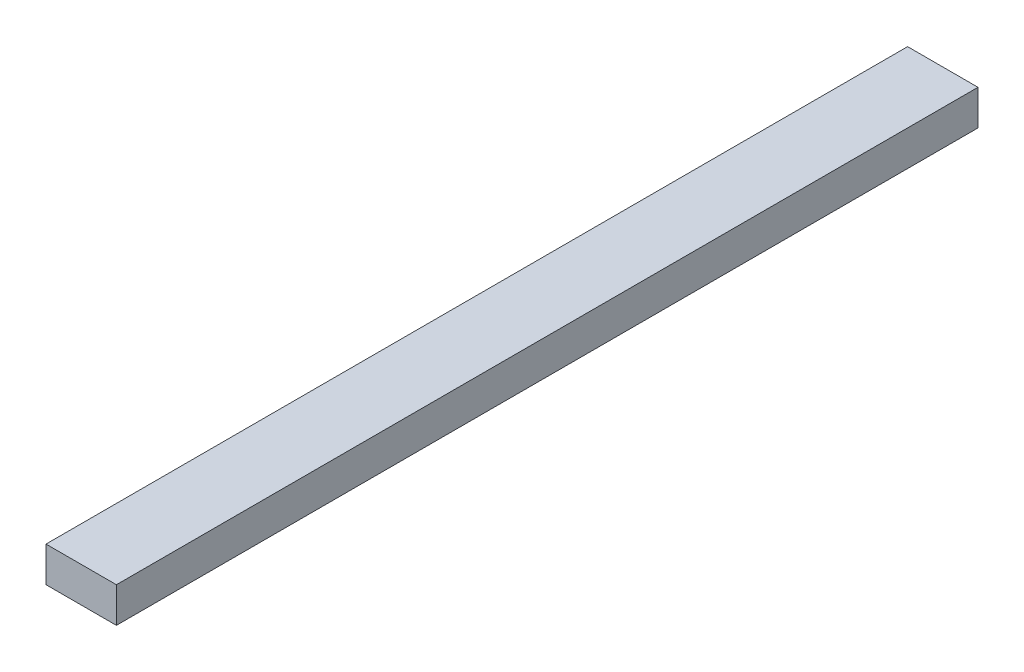
ISO-10303-21;
HEADER;
FILE_DESCRIPTION(('STEP AP214'),'2;1');
FILE_NAME('part.step','',(''),(''),'','','');
FILE_SCHEMA(('AUTOMOTIVE_DESIGN { 1 0 10303 214 1 1 1 1 }'));
ENDSEC;
DATA;
#1=APPLICATION_CONTEXT('core data for automotive mechanical design processes');
#2=APPLICATION_PROTOCOL_DEFINITION('international standard','automotive_design',2000,#1);
#3=PRODUCT_CONTEXT('',#1,'mechanical');
#4=PRODUCT('Part','Part','',(#3));
#5=PRODUCT_RELATED_PRODUCT_CATEGORY('part','',(#4));
#6=PRODUCT_DEFINITION_FORMATION('','',#4);
#7=PRODUCT_DEFINITION_CONTEXT('part definition',#1,'design');
#8=PRODUCT_DEFINITION('design','',#6,#7);
#9=PRODUCT_DEFINITION_SHAPE('','',#8);
#10=(LENGTH_UNIT() NAMED_UNIT(*) SI_UNIT(.MILLI.,.METRE.));
#11=(NAMED_UNIT(*) PLANE_ANGLE_UNIT() SI_UNIT($,.RADIAN.));
#12=(NAMED_UNIT(*) SI_UNIT($,.STERADIAN.) SOLID_ANGLE_UNIT());
#13=UNCERTAINTY_MEASURE_WITH_UNIT(LENGTH_MEASURE(1.E-05),#10,'distance_accuracy_value','');
#14=(GEOMETRIC_REPRESENTATION_CONTEXT(3) GLOBAL_UNCERTAINTY_ASSIGNED_CONTEXT((#13)) GLOBAL_UNIT_ASSIGNED_CONTEXT((#10,
#11,#12)) REPRESENTATION_CONTEXT('',''));
#15=CARTESIAN_POINT('',(0.,0.,0.));
#16=DIRECTION('',(0.,0.,1.));
#17=DIRECTION('',(1.,0.,0.));
#18=AXIS2_PLACEMENT_3D('',#15,#16,#17);
#19=CARTESIAN_POINT('',(25.4,-12.7,609.6));
#20=DIRECTION('',(-1.,0.,0.));
#21=DIRECTION('',(0.,0.,1.));
#22=AXIS2_PLACEMENT_3D('',#19,#20,#21);
#23=PLANE('',#22);
#24=DIRECTION('',(0.,1.,0.));
#25=VECTOR('',#24,1.);
#26=CARTESIAN_POINT('',(25.4,-12.7,0.));
#27=LINE('',#26,#25);
#28=CARTESIAN_POINT('',(25.4,-12.7,0.));
#29=VERTEX_POINT('',#28);
#30=CARTESIAN_POINT('',(25.4,12.7,0.));
#31=VERTEX_POINT('',#30);
#32=EDGE_CURVE('E97',#29,#31,#27,.T.);
#33=ORIENTED_EDGE('',*,*,#32,.T.);
#34=DIRECTION('',(0.,0.,-1.));
#35=VECTOR('',#34,1.);
#36=CARTESIAN_POINT('',(25.4,12.7,609.6));
#37=LINE('',#36,#35);
#38=CARTESIAN_POINT('',(25.4,12.7,621.6));
#39=VERTEX_POINT('',#38);
#40=EDGE_CURVE('E11',#39,#31,#37,.T.);
#41=ORIENTED_EDGE('',*,*,#40,.F.);
#42=DIRECTION('',(0.,1.,0.));
#43=VECTOR('',#42,1.);
#44=CARTESIAN_POINT('',(25.4,-12.7,621.6));
#45=LINE('',#44,#43);
#46=CARTESIAN_POINT('',(25.4,-12.7,621.6));
#47=VERTEX_POINT('',#46);
#48=EDGE_CURVE('E83',#47,#39,#45,.T.);
#49=ORIENTED_EDGE('',*,*,#48,.F.);
#50=DIRECTION('',(0.,0.,-1.));
#51=VECTOR('',#50,1.);
#52=CARTESIAN_POINT('',(25.4,-12.7,609.6));
#53=LINE('',#52,#51);
#54=EDGE_CURVE('E72',#47,#29,#53,.T.);
#55=ORIENTED_EDGE('',*,*,#54,.T.);
#56=EDGE_LOOP('',(#33,#41,#49,#55));
#57=FACE_BOUND('',#56,.T.);
#58=ADVANCED_FACE('F33',(#57),#23,.F.);
#59=CARTESIAN_POINT('',(-25.4,12.7,609.6));
#60=DIRECTION('',(0.,-1.,0.));
#61=DIRECTION('',(0.,0.,-1.));
#62=AXIS2_PLACEMENT_3D('',#59,#60,#61);
#63=PLANE('',#62);
#64=DIRECTION('',(-1.,0.,0.));
#65=VECTOR('',#64,1.);
#66=CARTESIAN_POINT('',(-25.4,12.7,0.));
#67=LINE('',#66,#65);
#68=CARTESIAN_POINT('',(-25.4,12.7,0.));
#69=VERTEX_POINT('',#68);
#70=EDGE_CURVE('E99',#31,#69,#67,.T.);
#71=ORIENTED_EDGE('',*,*,#70,.T.);
#72=DIRECTION('',(0.,0.,-1.));
#73=VECTOR('',#72,1.);
#74=CARTESIAN_POINT('',(-25.4,12.7,609.6));
#75=LINE('',#74,#73);
#76=CARTESIAN_POINT('',(-25.4,12.7,621.6));
#77=VERTEX_POINT('',#76);
#78=EDGE_CURVE('E40',#77,#69,#75,.T.);
#79=ORIENTED_EDGE('',*,*,#78,.F.);
#80=DIRECTION('',(-1.,0.,0.));
#81=VECTOR('',#80,1.);
#82=CARTESIAN_POINT('',(25.4,12.7,621.6));
#83=LINE('',#82,#81);
#84=EDGE_CURVE('E87',#39,#77,#83,.T.);
#85=ORIENTED_EDGE('',*,*,#84,.F.);
#86=ORIENTED_EDGE('',*,*,#40,.T.);
#87=EDGE_LOOP('',(#71,#79,#85,#86));
#88=FACE_BOUND('',#87,.T.);
#89=ADVANCED_FACE('F107',(#88),#63,.F.);
#90=CARTESIAN_POINT('',(-25.4,-12.7,609.6));
#91=DIRECTION('',(1.,0.,0.));
#92=DIRECTION('',(0.,0.,-1.));
#93=AXIS2_PLACEMENT_3D('',#90,#91,#92);
#94=PLANE('',#93);
#95=DIRECTION('',(0.,-1.,0.));
#96=VECTOR('',#95,1.);
#97=CARTESIAN_POINT('',(-25.4,-12.7,0.));
#98=LINE('',#97,#96);
#99=CARTESIAN_POINT('',(-25.4,-12.7,0.));
#100=VERTEX_POINT('',#99);
#101=EDGE_CURVE('E55',#69,#100,#98,.T.);
#102=ORIENTED_EDGE('',*,*,#101,.T.);
#103=DIRECTION('',(0.,0.,-1.));
#104=VECTOR('',#103,1.);
#105=CARTESIAN_POINT('',(-25.4,-12.7,609.6));
#106=LINE('',#105,#104);
#107=CARTESIAN_POINT('',(-25.4,-12.7,621.6));
#108=VERTEX_POINT('',#107);
#109=EDGE_CURVE('E80',#108,#100,#106,.T.);
#110=ORIENTED_EDGE('',*,*,#109,.F.);
#111=DIRECTION('',(0.,-1.,0.));
#112=VECTOR('',#111,1.);
#113=CARTESIAN_POINT('',(-25.4,12.7,621.6));
#114=LINE('',#113,#112);
#115=EDGE_CURVE('E92',#77,#108,#114,.T.);
#116=ORIENTED_EDGE('',*,*,#115,.F.);
#117=ORIENTED_EDGE('',*,*,#78,.T.);
#118=EDGE_LOOP('',(#102,#110,#116,#117));
#119=FACE_BOUND('',#118,.T.);
#120=ADVANCED_FACE('F103',(#119),#94,.F.);
#121=CARTESIAN_POINT('',(-25.4,-12.7,609.6));
#122=DIRECTION('',(0.,1.,0.));
#123=DIRECTION('',(0.,0.,1.));
#124=AXIS2_PLACEMENT_3D('',#121,#122,#123);
#125=PLANE('',#124);
#126=DIRECTION('',(1.,0.,0.));
#127=VECTOR('',#126,1.);
#128=CARTESIAN_POINT('',(-25.4,-12.7,0.));
#129=LINE('',#128,#127);
#130=EDGE_CURVE('E47',#100,#29,#129,.T.);
#131=ORIENTED_EDGE('',*,*,#130,.T.);
#132=ORIENTED_EDGE('',*,*,#54,.F.);
#133=DIRECTION('',(1.,0.,0.));
#134=VECTOR('',#133,1.);
#135=CARTESIAN_POINT('',(-25.4,-12.7,621.6));
#136=LINE('',#135,#134);
#137=EDGE_CURVE('E76',#108,#47,#136,.T.);
#138=ORIENTED_EDGE('',*,*,#137,.F.);
#139=ORIENTED_EDGE('',*,*,#109,.T.);
#140=EDGE_LOOP('',(#131,#132,#138,#139));
#141=FACE_BOUND('',#140,.T.);
#142=ADVANCED_FACE('F74',(#141),#125,.F.);
#143=CARTESIAN_POINT('',(0.,0.,0.));
#144=DIRECTION('',(0.,0.,-1.));
#145=DIRECTION('',(-1.,0.,0.));
#146=AXIS2_PLACEMENT_3D('',#143,#144,#145);
#147=PLANE('',#146);
#148=ORIENTED_EDGE('',*,*,#32,.F.);
#149=ORIENTED_EDGE('',*,*,#130,.F.);
#150=ORIENTED_EDGE('',*,*,#101,.F.);
#151=ORIENTED_EDGE('',*,*,#70,.F.);
#152=EDGE_LOOP('',(#148,#149,#150,#151));
#153=FACE_BOUND('',#152,.T.);
#154=ADVANCED_FACE('F106',(#153),#147,.T.);
#155=CARTESIAN_POINT('',(0.,0.,621.6));
#156=DIRECTION('',(0.,0.,1.));
#157=DIRECTION('',(1.,0.,0.));
#158=AXIS2_PLACEMENT_3D('',#155,#156,#157);
#159=PLANE('',#158);
#160=ORIENTED_EDGE('',*,*,#137,.T.);
#161=ORIENTED_EDGE('',*,*,#48,.T.);
#162=ORIENTED_EDGE('',*,*,#84,.T.);
#163=ORIENTED_EDGE('',*,*,#115,.T.);
#164=EDGE_LOOP('',(#160,#161,#162,#163));
#165=FACE_BOUND('',#164,.T.);
#166=ADVANCED_FACE('F90',(#165),#159,.T.);
#167=CLOSED_SHELL('',(#58,#89,#120,#142,#154,#166));
#168=MANIFOLD_SOLID_BREP('B2',#167);
#169=ADVANCED_BREP_SHAPE_REPRESENTATION('',(#18,#168),#14);
#170=SHAPE_DEFINITION_REPRESENTATION(#9,#169);
ENDSEC;
END-ISO-10303-21;
